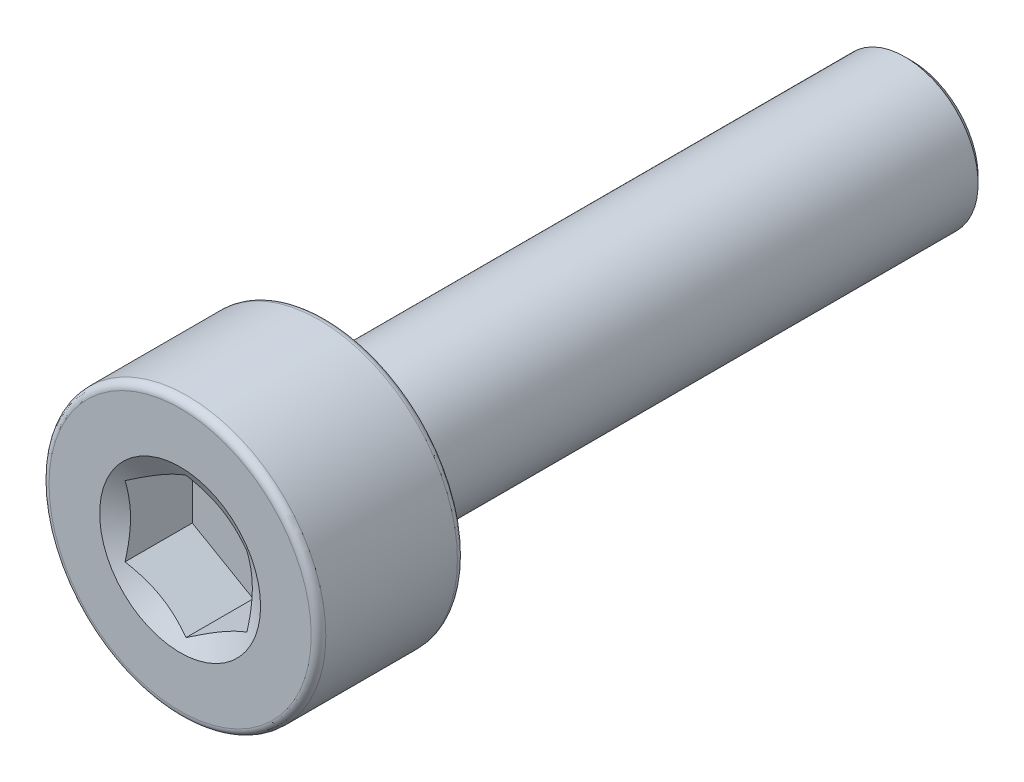
ISO-10303-21;
HEADER;
FILE_DESCRIPTION(('STEP AP214'),'2;1');
FILE_NAME('part.step','',(''),(''),'','','');
FILE_SCHEMA(('AUTOMOTIVE_DESIGN { 1 0 10303 214 1 1 1 1 }'));
ENDSEC;
DATA;
#1=APPLICATION_CONTEXT('core data for automotive mechanical design processes');
#2=APPLICATION_PROTOCOL_DEFINITION('international standard','automotive_design',2000,#1);
#3=PRODUCT_CONTEXT('',#1,'mechanical');
#4=PRODUCT('Part','Part','',(#3));
#5=PRODUCT_RELATED_PRODUCT_CATEGORY('part','',(#4));
#6=PRODUCT_DEFINITION_FORMATION('','',#4);
#7=PRODUCT_DEFINITION_CONTEXT('part definition',#1,'design');
#8=PRODUCT_DEFINITION('design','',#6,#7);
#9=PRODUCT_DEFINITION_SHAPE('','',#8);
#10=(LENGTH_UNIT() NAMED_UNIT(*) SI_UNIT(.MILLI.,.METRE.));
#11=(NAMED_UNIT(*) PLANE_ANGLE_UNIT() SI_UNIT($,.RADIAN.));
#12=(NAMED_UNIT(*) SI_UNIT($,.STERADIAN.) SOLID_ANGLE_UNIT());
#13=UNCERTAINTY_MEASURE_WITH_UNIT(LENGTH_MEASURE(1.E-05),#10,'distance_accuracy_value','');
#14=(GEOMETRIC_REPRESENTATION_CONTEXT(3) GLOBAL_UNCERTAINTY_ASSIGNED_CONTEXT((#13)) GLOBAL_UNIT_ASSIGNED_CONTEXT((#10,
#11,#12)) REPRESENTATION_CONTEXT('',''));
#15=CARTESIAN_POINT('',(0.,0.,0.));
#16=DIRECTION('',(0.,0.,1.));
#17=DIRECTION('',(1.,0.,0.));
#18=AXIS2_PLACEMENT_3D('',#15,#16,#17);
#19=CARTESIAN_POINT('',(0.,0.,-7.5));
#20=DIRECTION('',(0.,0.,-1.));
#21=DIRECTION('',(-1.,0.,0.));
#22=AXIS2_PLACEMENT_3D('',#19,#20,#21);
#23=PLANE('',#22);
#24=CARTESIAN_POINT('',(0.,0.,-7.5));
#25=DIRECTION('',(0.,0.,-1.));
#26=DIRECTION('',(-1.,0.,0.));
#27=AXIS2_PLACEMENT_3D('',#24,#25,#26);
#28=CIRCLE('',#27,1.375);
#29=CARTESIAN_POINT('',(-1.375,0.,-7.5));
#30=VERTEX_POINT('',#29);
#31=EDGE_CURVE('E55',#30,#30,#28,.T.);
#32=ORIENTED_EDGE('',*,*,#31,.T.);
#33=EDGE_LOOP('',(#32));
#34=FACE_BOUND('',#33,.T.);
#35=ADVANCED_FACE('F41',(#34),#23,.T.);
#36=CARTESIAN_POINT('',(0.,0.,-7.5));
#37=DIRECTION('',(0.,0.,1.));
#38=DIRECTION('',(1.,0.,0.));
#39=AXIS2_PLACEMENT_3D('',#36,#37,#38);
#40=CONICAL_SURFACE('',#39,1.375,0.785398163397447);
#41=CARTESIAN_POINT('',(0.,0.,-7.375));
#42=DIRECTION('',(0.,0.,-1.));
#43=DIRECTION('',(-1.,0.,0.));
#44=AXIS2_PLACEMENT_3D('',#41,#42,#43);
#45=CIRCLE('',#44,1.5);
#46=CARTESIAN_POINT('',(-1.5,0.,-7.375));
#47=VERTEX_POINT('',#46);
#48=EDGE_CURVE('E149',#47,#47,#45,.T.);
#49=ORIENTED_EDGE('',*,*,#48,.T.);
#50=EDGE_LOOP('',(#49));
#51=FACE_BOUND('',#50,.T.);
#52=ORIENTED_EDGE('',*,*,#31,.F.);
#53=EDGE_LOOP('',(#52));
#54=FACE_BOUND('',#53,.T.);
#55=ADVANCED_FACE('F157',(#51,#54),#40,.T.);
#56=CARTESIAN_POINT('',(0.,0.,-7.5));
#57=DIRECTION('',(0.,0.,-1.));
#58=DIRECTION('',(-1.,0.,0.));
#59=AXIS2_PLACEMENT_3D('',#56,#57,#58);
#60=CYLINDRICAL_SURFACE('',#59,1.5);
#61=CARTESIAN_POINT('',(0.,0.,4.5));
#62=DIRECTION('',(0.,0.,-1.));
#63=DIRECTION('',(-1.,0.,0.));
#64=AXIS2_PLACEMENT_3D('',#61,#62,#63);
#65=CIRCLE('',#64,1.5);
#66=CARTESIAN_POINT('',(-1.5,0.,4.5));
#67=VERTEX_POINT('',#66);
#68=EDGE_CURVE('E145',#67,#67,#65,.T.);
#69=ORIENTED_EDGE('',*,*,#68,.T.);
#70=EDGE_LOOP('',(#69));
#71=FACE_BOUND('',#70,.T.);
#72=ORIENTED_EDGE('',*,*,#48,.F.);
#73=EDGE_LOOP('',(#72));
#74=FACE_BOUND('',#73,.T.);
#75=ADVANCED_FACE('F159',(#71,#74),#60,.T.);
#76=CARTESIAN_POINT('',(0.,1.5,4.5));
#77=DIRECTION('',(0.,0.,-1.));
#78=DIRECTION('',(-1.,0.,0.));
#79=AXIS2_PLACEMENT_3D('',#76,#77,#78);
#80=PLANE('',#79);
#81=CARTESIAN_POINT('',(0.,0.,4.5));
#82=DIRECTION('',(0.,0.,-1.));
#83=DIRECTION('',(-1.,0.,0.));
#84=AXIS2_PLACEMENT_3D('',#81,#82,#83);
#85=CIRCLE('',#84,2.69);
#86=CARTESIAN_POINT('',(-2.69,0.,4.5));
#87=VERTEX_POINT('',#86);
#88=EDGE_CURVE('E141',#87,#87,#85,.T.);
#89=ORIENTED_EDGE('',*,*,#88,.T.);
#90=EDGE_LOOP('',(#89));
#91=FACE_BOUND('',#90,.T.);
#92=ORIENTED_EDGE('',*,*,#68,.F.);
#93=EDGE_LOOP('',(#92));
#94=FACE_BOUND('',#93,.T.);
#95=ADVANCED_FACE('F165',(#91,#94),#80,.T.);
#96=CARTESIAN_POINT('',(0.,0.,4.65));
#97=DIRECTION('',(0.,0.,-1.));
#98=DIRECTION('',(-1.,0.,0.));
#99=AXIS2_PLACEMENT_3D('',#96,#97,#98);
#100=TOROIDAL_SURFACE('',#99,2.69,0.15);
#101=CARTESIAN_POINT('',(0.,0.,4.65));
#102=DIRECTION('',(0.,0.,-1.));
#103=DIRECTION('',(-1.,0.,0.));
#104=AXIS2_PLACEMENT_3D('',#101,#102,#103);
#105=CIRCLE('',#104,2.84);
#106=CARTESIAN_POINT('',(-2.84,0.,4.65));
#107=VERTEX_POINT('',#106);
#108=EDGE_CURVE('E137',#107,#107,#105,.T.);
#109=ORIENTED_EDGE('',*,*,#108,.T.);
#110=EDGE_LOOP('',(#109));
#111=FACE_BOUND('',#110,.T.);
#112=ORIENTED_EDGE('',*,*,#88,.F.);
#113=EDGE_LOOP('',(#112));
#114=FACE_BOUND('',#113,.T.);
#115=ADVANCED_FACE('F171',(#111,#114),#100,.T.);
#116=CARTESIAN_POINT('',(0.,0.,-7.5));
#117=DIRECTION('',(0.,0.,-1.));
#118=DIRECTION('',(-1.,0.,0.));
#119=AXIS2_PLACEMENT_3D('',#116,#117,#118);
#120=CYLINDRICAL_SURFACE('',#119,2.84);
#121=CARTESIAN_POINT('',(0.,0.,7.35));
#122=DIRECTION('',(0.,0.,-1.));
#123=DIRECTION('',(-1.,0.,0.));
#124=AXIS2_PLACEMENT_3D('',#121,#122,#123);
#125=CIRCLE('',#124,2.84);
#126=CARTESIAN_POINT('',(-2.84,0.,7.35));
#127=VERTEX_POINT('',#126);
#128=EDGE_CURVE('E133',#127,#127,#125,.T.);
#129=ORIENTED_EDGE('',*,*,#128,.T.);
#130=EDGE_LOOP('',(#129));
#131=FACE_BOUND('',#130,.T.);
#132=ORIENTED_EDGE('',*,*,#108,.F.);
#133=EDGE_LOOP('',(#132));
#134=FACE_BOUND('',#133,.T.);
#135=ADVANCED_FACE('F175',(#131,#134),#120,.T.);
#136=CARTESIAN_POINT('',(0.,0.,7.35));
#137=DIRECTION('',(0.,0.,-1.));
#138=DIRECTION('',(-1.,0.,0.));
#139=AXIS2_PLACEMENT_3D('',#136,#137,#138);
#140=TOROIDAL_SURFACE('',#139,2.69,0.15);
#141=CARTESIAN_POINT('',(0.,0.,7.5));
#142=DIRECTION('',(0.,0.,-1.));
#143=DIRECTION('',(-1.,0.,0.));
#144=AXIS2_PLACEMENT_3D('',#141,#142,#143);
#145=CIRCLE('',#144,2.69);
#146=CARTESIAN_POINT('',(-2.69,0.,7.5));
#147=VERTEX_POINT('',#146);
#148=EDGE_CURVE('E129',#147,#147,#145,.T.);
#149=ORIENTED_EDGE('',*,*,#148,.T.);
#150=EDGE_LOOP('',(#149));
#151=FACE_BOUND('',#150,.T.);
#152=ORIENTED_EDGE('',*,*,#128,.F.);
#153=EDGE_LOOP('',(#152));
#154=FACE_BOUND('',#153,.T.);
#155=ADVANCED_FACE('F179',(#151,#154),#140,.T.);
#156=CARTESIAN_POINT('',(0.,2.69,7.5));
#157=DIRECTION('',(0.,0.,1.));
#158=DIRECTION('',(1.,0.,0.));
#159=AXIS2_PLACEMENT_3D('',#156,#157,#158);
#160=PLANE('',#159);
#161=CARTESIAN_POINT('',(0.,0.,7.5));
#162=DIRECTION('',(0.,0.,1.));
#163=DIRECTION('',(1.,0.,0.));
#164=AXIS2_PLACEMENT_3D('',#161,#162,#163);
#165=CIRCLE('',#164,1.65114639414505);
#166=CARTESIAN_POINT('',(1.65114639414505,0.,7.5));
#167=VERTEX_POINT('',#166);
#168=EDGE_CURVE('E287',#167,#167,#165,.T.);
#169=ORIENTED_EDGE('',*,*,#168,.F.);
#170=EDGE_LOOP('',(#169));
#171=FACE_BOUND('',#170,.T.);
#172=ORIENTED_EDGE('',*,*,#148,.F.);
#173=EDGE_LOOP('',(#172));
#174=FACE_BOUND('',#173,.T.);
#175=ADVANCED_FACE('F183',(#171,#174),#160,.T.);
#176=CARTESIAN_POINT('',(0.,0.,7.5));
#177=DIRECTION('',(0.,0.,1.));
#178=DIRECTION('',(1.,0.,0.));
#179=AXIS2_PLACEMENT_3D('',#176,#177,#178);
#180=CONICAL_SURFACE('',#179,1.65114639414505,1.0471975511966);
#181=ORIENTED_EDGE('',*,*,#168,.T.);
#182=EDGE_LOOP('',(#181));
#183=FACE_BOUND('',#182,.T.);
#184=CARTESIAN_POINT('',(1.2502,0.721572366433193,7.38011019286823));
#185=CARTESIAN_POINT('',(1.19526669476823,0.753288124996229,7.3617894329659));
#186=CARTESIAN_POINT('',(1.13985921349976,0.785277649221702,7.34512682440284));
#187=CARTESIAN_POINT('',(1.02808463239966,0.849810733708402,7.31604082214798));
#188=CARTESIAN_POINT('',(0.971715545158288,0.882355441401181,7.30362772017826));
#189=CARTESIAN_POINT('',(0.859676025913014,0.947041487997316,7.28430320583822));
#190=CARTESIAN_POINT('',(0.804022841540769,0.979172868975891,7.27726320764964));
#191=CARTESIAN_POINT('',(0.692454346091608,1.04358696985655,7.26885595083284));
#192=CARTESIAN_POINT('',(0.636539441062399,1.07586945532687,7.26748173340693));
#193=CARTESIAN_POINT('',(0.532042078818274,1.13620103554812,7.27032685557013));
#194=CARTESIAN_POINT('',(0.483444050118684,1.16425912049992,7.27384761702222));
#195=CARTESIAN_POINT('',(0.386564637826761,1.22019247526559,7.28501063090146));
#196=CARTESIAN_POINT('',(0.338283589807836,1.24806755133607,7.29265670377488));
#197=CARTESIAN_POINT('',(0.241204116145957,1.30411641158755,7.31177297290274));
#198=CARTESIAN_POINT('',(0.1924179896481,1.3322830948538,7.32332427518186));
#199=CARTESIAN_POINT('',(0.0955737477078975,1.38819614400745,7.3495418328961));
#200=CARTESIAN_POINT('',(0.0475143896730352,1.41594322730595,7.36420192034131));
#201=CARTESIAN_POINT('',(-0.000200000000000399,1.4434911430279,7.38011019286823));
#202=B_SPLINE_CURVE_WITH_KNOTS('',3,(#184,#185,#186,#187,#188,#189,#190,#191,#192,#193,#194,
#195,#196,#197,#198,#199,#200,#201),.UNSPECIFIED.,.F.,.F.,(4,2,2,2,2,2,2,2,4),(0.,
0.198150821029559,0.39677819631522,0.590488617354399,0.78396104931718,0.952480056398644,
1.1211553973001,1.2935743034359,1.4656542697693),.UNSPECIFIED.);
#203=CARTESIAN_POINT('',(1.25,0.721687836487031,7.38004351820221));
#204=VERTEX_POINT('',#203);
#205=CARTESIAN_POINT('',(0.,1.44337567297406,7.38004351820221));
#206=VERTEX_POINT('',#205);
#207=EDGE_CURVE('E110',#204,#206,#202,.T.);
#208=ORIENTED_EDGE('',*,*,#207,.F.);
#209=CARTESIAN_POINT('',(1.25,-1.89672738298304,7.85820739103665));
#210=CARTESIAN_POINT('',(1.25,-1.84244697339851,7.83204758050302));
#211=CARTESIAN_POINT('',(1.25,-1.78803742306522,7.80615118014362));
#212=CARTESIAN_POINT('',(1.25,-1.67889087538101,7.75503415816502));
#213=CARTESIAN_POINT('',(1.25,-1.62415382383406,7.72981365240367));
#214=CARTESIAN_POINT('',(1.25,-1.51398064315423,7.68006147462495));
#215=CARTESIAN_POINT('',(1.25,-1.45854229808874,7.65553468818875));
#216=CARTESIAN_POINT('',(1.25,-1.3472103466392,7.60754371169523));
#217=CARTESIAN_POINT('',(1.25,-1.29131676332858,7.58407946817427));
#218=CARTESIAN_POINT('',(1.25,-1.1773905129574,7.53784726543424));
#219=CARTESIAN_POINT('',(1.25,-1.11934204218602,7.5151177395224));
#220=CARTESIAN_POINT('',(1.25,-1.00256295352062,7.47149048953119));
#221=CARTESIAN_POINT('',(1.25,-0.943832252207076,7.45059299219036));
#222=CARTESIAN_POINT('',(1.25,-0.766698171960766,7.39149941011908));
#223=CARTESIAN_POINT('',(1.25,-0.647040815007729,7.35676986123052));
#224=CARTESIAN_POINT('',(1.25,-0.465275031508043,7.31610545317371));
#225=CARTESIAN_POINT('',(1.25,-0.404449052025901,7.30446938181936));
#226=CARTESIAN_POINT('',(1.25,-0.282083439429401,7.28576169296872));
#227=CARTESIAN_POINT('',(1.25,-0.220543865054811,7.27868970245605));
#228=CARTESIAN_POINT('',(1.25,-0.0978463032494955,7.26976463505209));
#229=CARTESIAN_POINT('',(1.25,-0.0366930766242037,7.26784779832336));
#230=CARTESIAN_POINT('',(1.25,0.0855533287559672,7.26922388244837));
#231=CARTESIAN_POINT('',(1.25,0.146646504184141,7.27251707726163));
#232=CARTESIAN_POINT('',(1.25,0.295739502729868,7.28662138689044));
#233=CARTESIAN_POINT('',(1.25,0.383482820966709,7.30014757839795));
#234=CARTESIAN_POINT('',(1.25,0.557311129169654,7.33546745225414));
#235=CARTESIAN_POINT('',(1.25,0.643394053579766,7.35727081202823));
#236=CARTESIAN_POINT('',(1.25,0.77216311196591,7.39471282943676));
#237=CARTESIAN_POINT('',(1.25,0.81551101183558,7.40816166837346));
#238=CARTESIAN_POINT('',(1.25,0.901755776899675,7.43635409429472));
#239=CARTESIAN_POINT('',(1.25,0.944652901540779,7.45109688501211));
#240=CARTESIAN_POINT('',(1.25,1.03005194087421,7.48165843781438));
#241=CARTESIAN_POINT('',(1.25,1.07255391468212,7.49747703591271));
#242=CARTESIAN_POINT('',(1.25,1.15721893845588,7.53001390964596));
#243=CARTESIAN_POINT('',(1.25,1.19938193143513,7.54673233306143));
#244=CARTESIAN_POINT('',(1.25,1.30957317351973,7.5915601021517));
#245=CARTESIAN_POINT('',(1.25,1.37735359090853,7.62027807640225));
#246=CARTESIAN_POINT('',(1.25,1.51227198573638,7.67918973729043));
#247=CARTESIAN_POINT('',(1.25,1.57940990698805,7.70938355160778));
#248=CARTESIAN_POINT('',(1.25,1.78008192300026,7.80164510995911));
#249=CARTESIAN_POINT('',(1.25,1.91284709613453,7.86538155434581));
#250=CARTESIAN_POINT('',(1.25,2.17721685013336,7.99562640704071));
#251=CARTESIAN_POINT('',(1.25,2.30881961832862,8.06213844802241));
#252=CARTESIAN_POINT('',(1.25,2.57110039577172,8.19691083988223));
#253=CARTESIAN_POINT('',(1.25,2.7017785387637,8.26517093102774));
#254=CARTESIAN_POINT('',(1.25,2.94959895946171,8.39607031881277));
#255=CARTESIAN_POINT('',(1.25,3.06680080815012,8.45859724686987));
#256=CARTESIAN_POINT('',(1.25,3.30082634149276,8.58436636721232));
#257=CARTESIAN_POINT('',(1.25,3.41765000951273,8.64760859042454));
#258=CARTESIAN_POINT('',(1.25,3.65068181727598,8.77444954911949));
#259=CARTESIAN_POINT('',(1.25,3.76689076518814,8.83804680186742));
#260=CARTESIAN_POINT('',(1.25,3.99907349967148,8.96565314056215));
#261=CARTESIAN_POINT('',(1.25,4.1150472996979,9.02966220201733));
#262=CARTESIAN_POINT('',(1.25,4.23093732511405,9.09382166319376));
#263=B_SPLINE_CURVE_WITH_KNOTS('',3,(#209,#210,#211,#212,#213,#214,#215,#216,#217,#218,#219,
#220,#221,#222,#223,#224,#225,#226,#227,#228,#229,#230,#231,#232,#233,#234,#235,#236,#237,#238,
#239,#240,#241,#242,#243,#244,#245,#246,#247,#248,#249,#250,#251,#252,#253,#254,#255,#256,#257,
#258,#259,#260,#261,#262),.UNSPECIFIED.,.F.,.F.,(4,2,2,2,2,2,2,2,2,2,2,2,2,2,2,2,2,2,2,2,2,2,2,
2,2,2,4),(0.,0.180768009400502,0.361566809316154,0.543421958009169,0.725267946159936,
0.912254441114668,1.0992640456265,1.47226798684474,1.65791746177348,1.84355176188995,
2.02687931237144,2.21021650310079,2.47601053535726,2.74211628817199,2.8782594310705,
3.01431937437467,3.15035862419056,3.28642028465225,3.50723410295543,3.72806705850746,
4.16982133944192,4.61217312406906,5.05445955926298,5.45297027921854,5.85149829575065,
6.24891679007933,6.64631186318741),.UNSPECIFIED.);
#264=CARTESIAN_POINT('',(1.25,-0.72168783648703,7.38004351820221));
#265=VERTEX_POINT('',#264);
#266=EDGE_CURVE('E229',#265,#204,#263,.T.);
#267=ORIENTED_EDGE('',*,*,#266,.F.);
#268=CARTESIAN_POINT('',(-0.000200000000000427,-1.4434911430279,7.38011019286823));
#269=CARTESIAN_POINT('',(0.0547333052317645,-1.41177538446486,7.3617894329659));
#270=CARTESIAN_POINT('',(0.110140786500239,-1.37978586023939,7.34512682440284));
#271=CARTESIAN_POINT('',(0.221915367600339,-1.31525277575269,7.31604082214798));
#272=CARTESIAN_POINT('',(0.278284454841709,-1.28270806805991,7.30362772017826));
#273=CARTESIAN_POINT('',(0.390323974086983,-1.21802202146378,7.28430320583822));
#274=CARTESIAN_POINT('',(0.445977158459228,-1.1858906404852,7.27726320764964));
#275=CARTESIAN_POINT('',(0.55754565390839,-1.12147653960455,7.26885595083284));
#276=CARTESIAN_POINT('',(0.613460558937598,-1.08919405413422,7.26748173340693));
#277=CARTESIAN_POINT('',(0.717957921181723,-1.02886247391297,7.27032685557013));
#278=CARTESIAN_POINT('',(0.766555949881313,-1.00080438896118,7.27384761702222));
#279=CARTESIAN_POINT('',(0.863435362173236,-0.944871034195502,7.28501063090146));
#280=CARTESIAN_POINT('',(0.911716410192161,-0.916995958125018,7.29265670377488));
#281=CARTESIAN_POINT('',(1.00879588385404,-0.860947097873545,7.31177297290274));
#282=CARTESIAN_POINT('',(1.0575820103519,-0.832780414607288,7.32332427518186));
#283=CARTESIAN_POINT('',(1.1544262522921,-0.776867365453647,7.3495418328961));
#284=CARTESIAN_POINT('',(1.20248561032696,-0.749120282155139,7.36420192034131));
#285=CARTESIAN_POINT('',(1.2502,-0.721572366433193,7.38011019286823));
#286=B_SPLINE_CURVE_WITH_KNOTS('',3,(#268,#269,#270,#271,#272,#273,#274,#275,#276,#277,#278,
#279,#280,#281,#282,#283,#284,#285),.UNSPECIFIED.,.F.,.F.,(4,2,2,2,2,2,2,2,4),(0.,
0.198150821029559,0.39677819631522,0.590488617354398,0.78396104931718,0.952480056398644,
1.1211553973001,1.2935743034359,1.4656542697693),.UNSPECIFIED.);
#287=CARTESIAN_POINT('',(0.,-1.44337567297406,7.38004351820221));
#288=VERTEX_POINT('',#287);
#289=EDGE_CURVE('E223',#288,#265,#286,.T.);
#290=ORIENTED_EDGE('',*,*,#289,.F.);
#291=CARTESIAN_POINT('',(-1.2502,-0.721572366433193,7.38011019286823));
#292=CARTESIAN_POINT('',(-1.19526669476823,-0.753288124996229,7.3617894329659));
#293=CARTESIAN_POINT('',(-1.13985921349976,-0.785277649221702,7.34512682440284));
#294=CARTESIAN_POINT('',(-1.02808463239966,-0.849810733708402,7.31604082214798));
#295=CARTESIAN_POINT('',(-0.971715545158288,-0.882355441401181,7.30362772017826));
#296=CARTESIAN_POINT('',(-0.859676025913014,-0.947041487997316,7.28430320583822));
#297=CARTESIAN_POINT('',(-0.804022841540769,-0.979172868975892,7.27726320764964));
#298=CARTESIAN_POINT('',(-0.692454346091607,-1.04358696985655,7.26885595083284));
#299=CARTESIAN_POINT('',(-0.636539441062398,-1.07586945532687,7.26748173340693));
#300=CARTESIAN_POINT('',(-0.532042078818274,-1.13620103554812,7.27032685557013));
#301=CARTESIAN_POINT('',(-0.483444050118684,-1.16425912049992,7.27384761702222));
#302=CARTESIAN_POINT('',(-0.386564637826761,-1.22019247526559,7.28501063090146));
#303=CARTESIAN_POINT('',(-0.338283589807836,-1.24806755133608,7.29265670377488));
#304=CARTESIAN_POINT('',(-0.241204116145957,-1.30411641158755,7.31177297290274));
#305=CARTESIAN_POINT('',(-0.1924179896481,-1.3322830948538,7.32332427518187));
#306=CARTESIAN_POINT('',(-0.0955737477078978,-1.38819614400745,7.3495418328961));
#307=CARTESIAN_POINT('',(-0.0475143896730358,-1.41594322730595,7.36420192034131));
#308=CARTESIAN_POINT('',(0.000199999999999786,-1.4434911430279,7.38011019286823));
#309=B_SPLINE_CURVE_WITH_KNOTS('',3,(#291,#292,#293,#294,#295,#296,#297,#298,#299,#300,#301,
#302,#303,#304,#305,#306,#307,#308),.UNSPECIFIED.,.F.,.F.,(4,2,2,2,2,2,2,2,4),(0.,
0.198150821029559,0.39677819631522,0.590488617354399,0.783961049317181,0.952480056398644,
1.1211553973001,1.2935743034359,1.4656542697693),.UNSPECIFIED.);
#310=CARTESIAN_POINT('',(-1.25,-0.721687836487031,7.38004351820221));
#311=VERTEX_POINT('',#310);
#312=EDGE_CURVE('E62',#311,#288,#309,.T.);
#313=ORIENTED_EDGE('',*,*,#312,.F.);
#314=CARTESIAN_POINT('',(-1.25,-1.89672738298304,7.85820739103665));
#315=CARTESIAN_POINT('',(-1.25,-1.84244697339851,7.83204758050302));
#316=CARTESIAN_POINT('',(-1.25,-1.78803742306522,7.80615118014362));
#317=CARTESIAN_POINT('',(-1.25,-1.67889087538101,7.75503415816502));
#318=CARTESIAN_POINT('',(-1.25,-1.62415382383407,7.72981365240367));
#319=CARTESIAN_POINT('',(-1.25,-1.51398064315423,7.68006147462495));
#320=CARTESIAN_POINT('',(-1.25,-1.45854229808874,7.65553468818875));
#321=CARTESIAN_POINT('',(-1.25,-1.3472103466392,7.60754371169523));
#322=CARTESIAN_POINT('',(-1.25,-1.29131676332858,7.58407946817427));
#323=CARTESIAN_POINT('',(-1.25,-1.1773905129574,7.53784726543424));
#324=CARTESIAN_POINT('',(-1.25,-1.11934204218602,7.5151177395224));
#325=CARTESIAN_POINT('',(-1.25,-1.00256295352062,7.47149048953119));
#326=CARTESIAN_POINT('',(-1.25,-0.943832252207076,7.45059299219036));
#327=CARTESIAN_POINT('',(-1.25,-0.766698171960767,7.39149941011908));
#328=CARTESIAN_POINT('',(-1.25,-0.647040815007729,7.35676986123052));
#329=CARTESIAN_POINT('',(-1.25,-0.465275031508043,7.31610545317371));
#330=CARTESIAN_POINT('',(-1.25,-0.404449052025901,7.30446938181936));
#331=CARTESIAN_POINT('',(-1.25,-0.282083439429401,7.28576169296872));
#332=CARTESIAN_POINT('',(-1.25,-0.220543865054811,7.27868970245605));
#333=CARTESIAN_POINT('',(-1.25,-0.0978463032494959,7.26976463505209));
#334=CARTESIAN_POINT('',(-1.25,-0.0366930766242041,7.26784779832336));
#335=CARTESIAN_POINT('',(-1.25,0.0855533287559667,7.26922388244837));
#336=CARTESIAN_POINT('',(-1.25,0.14664650418414,7.27251707726163));
#337=CARTESIAN_POINT('',(-1.25,0.295739502729868,7.28662138689044));
#338=CARTESIAN_POINT('',(-1.25,0.383482820966708,7.30014757839795));
#339=CARTESIAN_POINT('',(-1.25,0.557311129169653,7.33546745225414));
#340=CARTESIAN_POINT('',(-1.25,0.643394053579765,7.35727081202823));
#341=CARTESIAN_POINT('',(-1.25,0.772163111965909,7.39471282943676));
#342=CARTESIAN_POINT('',(-1.25,0.815511011835579,7.40816166837345));
#343=CARTESIAN_POINT('',(-1.25,0.901755776899674,7.43635409429472));
#344=CARTESIAN_POINT('',(-1.25,0.944652901540778,7.45109688501211));
#345=CARTESIAN_POINT('',(-1.25,1.03005194087421,7.48165843781438));
#346=CARTESIAN_POINT('',(-1.25,1.07255391468212,7.49747703591271));
#347=CARTESIAN_POINT('',(-1.25,1.15721893845588,7.53001390964596));
#348=CARTESIAN_POINT('',(-1.25,1.19938193143513,7.54673233306143));
#349=CARTESIAN_POINT('',(-1.25,1.30957317351973,7.5915601021517));
#350=CARTESIAN_POINT('',(-1.25,1.37735359090853,7.62027807640225));
#351=CARTESIAN_POINT('',(-1.25,1.51227198573638,7.67918973729043));
#352=CARTESIAN_POINT('',(-1.25,1.57940990698804,7.70938355160778));
#353=CARTESIAN_POINT('',(-1.25,1.78008192300026,7.80164510995911));
#354=CARTESIAN_POINT('',(-1.25,1.91284709613453,7.86538155434581));
#355=CARTESIAN_POINT('',(-1.25,2.17721685013336,7.99562640704071));
#356=CARTESIAN_POINT('',(-1.25,2.30881961832861,8.06213844802241));
#357=CARTESIAN_POINT('',(-1.25,2.57110039577171,8.19691083988223));
#358=CARTESIAN_POINT('',(-1.25,2.7017785387637,8.26517093102774));
#359=CARTESIAN_POINT('',(-1.25,2.94959895946171,8.39607031881277));
#360=CARTESIAN_POINT('',(-1.25,3.06680080815011,8.45859724686986));
#361=CARTESIAN_POINT('',(-1.25,3.30082634149275,8.58436636721232));
#362=CARTESIAN_POINT('',(-1.25,3.41765000951273,8.64760859042454));
#363=CARTESIAN_POINT('',(-1.25,3.65068181727598,8.77444954911949));
#364=CARTESIAN_POINT('',(-1.25,3.76689076518814,8.83804680186742));
#365=CARTESIAN_POINT('',(-1.25,3.99907349967148,8.96565314056215));
#366=CARTESIAN_POINT('',(-1.25,4.1150472996979,9.02966220201733));
#367=CARTESIAN_POINT('',(-1.25,4.23093732511405,9.09382166319376));
#368=B_SPLINE_CURVE_WITH_KNOTS('',3,(#314,#315,#316,#317,#318,#319,#320,#321,#322,#323,#324,
#325,#326,#327,#328,#329,#330,#331,#332,#333,#334,#335,#336,#337,#338,#339,#340,#341,#342,#343,
#344,#345,#346,#347,#348,#349,#350,#351,#352,#353,#354,#355,#356,#357,#358,#359,#360,#361,#362,
#363,#364,#365,#366,#367),.UNSPECIFIED.,.F.,.F.,(4,2,2,2,2,2,2,2,2,2,2,2,2,2,2,2,2,2,2,2,2,2,2,
2,2,2,4),(0.,0.180768009400503,0.361566809316154,0.543421958009171,0.725267946159938,
0.912254441114669,1.0992640456265,1.47226798684474,1.65791746177348,1.84355176188995,
2.02687931237144,2.21021650310079,2.47601053535727,2.74211628817199,2.8782594310705,
3.01431937437467,3.15035862419056,3.28642028465225,3.50723410295543,3.72806705850746,
4.16982133944192,4.61217312406906,5.05445955926298,5.45297027921854,5.85149829575065,
6.24891679007933,6.64631186318741),.UNSPECIFIED.);
#369=CARTESIAN_POINT('',(-1.25,0.721687836487031,7.38004351820221));
#370=VERTEX_POINT('',#369);
#371=EDGE_CURVE('E11',#370,#311,#368,.F.);
#372=ORIENTED_EDGE('',*,*,#371,.F.);
#373=CARTESIAN_POINT('',(0.000199999999999659,1.4434911430279,7.38011019286823));
#374=CARTESIAN_POINT('',(-0.0547333052317652,1.41177538446486,7.3617894329659));
#375=CARTESIAN_POINT('',(-0.11014078650024,1.37978586023939,7.34512682440284));
#376=CARTESIAN_POINT('',(-0.22191536760034,1.31525277575269,7.31604082214798));
#377=CARTESIAN_POINT('',(-0.27828445484171,1.28270806805991,7.30362772017826));
#378=CARTESIAN_POINT('',(-0.390323974086984,1.21802202146378,7.28430320583822));
#379=CARTESIAN_POINT('',(-0.445977158459229,1.1858906404852,7.27726320764964));
#380=CARTESIAN_POINT('',(-0.557545653908391,1.12147653960455,7.26885595083284));
#381=CARTESIAN_POINT('',(-0.6134605589376,1.08919405413422,7.26748173340693));
#382=CARTESIAN_POINT('',(-0.717957921181724,1.02886247391297,7.27032685557013));
#383=CARTESIAN_POINT('',(-0.766555949881314,1.00080438896118,7.27384761702222));
#384=CARTESIAN_POINT('',(-0.863435362173237,0.944871034195502,7.28501063090146));
#385=CARTESIAN_POINT('',(-0.911716410192162,0.916995958125019,7.29265670377488));
#386=CARTESIAN_POINT('',(-1.00879588385404,0.860947097873545,7.31177297290274));
#387=CARTESIAN_POINT('',(-1.0575820103519,0.832780414607288,7.32332427518186));
#388=CARTESIAN_POINT('',(-1.1544262522921,0.776867365453647,7.3495418328961));
#389=CARTESIAN_POINT('',(-1.20248561032696,0.749120282155139,7.36420192034131));
#390=CARTESIAN_POINT('',(-1.2502,0.721572366433193,7.38011019286823));
#391=B_SPLINE_CURVE_WITH_KNOTS('',3,(#373,#374,#375,#376,#377,#378,#379,#380,#381,#382,#383,
#384,#385,#386,#387,#388,#389,#390),.UNSPECIFIED.,.F.,.F.,(4,2,2,2,2,2,2,2,4),(0.,
0.198150821029559,0.39677819631522,0.590488617354399,0.783961049317181,0.952480056398644,
1.1211553973001,1.2935743034359,1.4656542697693),.UNSPECIFIED.);
#392=EDGE_CURVE('E100',#206,#370,#391,.T.);
#393=ORIENTED_EDGE('',*,*,#392,.F.);
#394=EDGE_LOOP('',(#208,#267,#290,#313,#372,#393));
#395=FACE_BOUND('',#394,.T.);
#396=ADVANCED_FACE('F99',(#183,#395),#180,.F.);
#397=CARTESIAN_POINT('',(0.,0.,6.));
#398=DIRECTION('',(0.,0.,1.));
#399=DIRECTION('',(1.,0.,0.));
#400=AXIS2_PLACEMENT_3D('',#397,#398,#399);
#401=PLANE('',#400);
#402=DIRECTION('',(-0.866025403784439,-0.5,0.));
#403=VECTOR('',#402,1.);
#404=CARTESIAN_POINT('',(0.,1.44337567297406,6.));
#405=LINE('',#404,#403);
#406=CARTESIAN_POINT('',(0.,1.44337567297406,6.));
#407=VERTEX_POINT('',#406);
#408=CARTESIAN_POINT('',(-1.25,0.721687836487031,6.));
#409=VERTEX_POINT('',#408);
#410=EDGE_CURVE('E109',#407,#409,#405,.T.);
#411=ORIENTED_EDGE('',*,*,#410,.T.);
#412=DIRECTION('',(0.,-1.,0.));
#413=VECTOR('',#412,1.);
#414=CARTESIAN_POINT('',(-1.25,0.721687836487031,6.));
#415=LINE('',#414,#413);
#416=CARTESIAN_POINT('',(-1.25,-0.721687836487031,6.));
#417=VERTEX_POINT('',#416);
#418=EDGE_CURVE('E114',#409,#417,#415,.T.);
#419=ORIENTED_EDGE('',*,*,#418,.T.);
#420=DIRECTION('',(0.866025403784439,-0.5,0.));
#421=VECTOR('',#420,1.);
#422=CARTESIAN_POINT('',(-1.25,-0.721687836487031,6.));
#423=LINE('',#422,#421);
#424=CARTESIAN_POINT('',(0.,-1.44337567297406,6.));
#425=VERTEX_POINT('',#424);
#426=EDGE_CURVE('E256',#417,#425,#423,.T.);
#427=ORIENTED_EDGE('',*,*,#426,.T.);
#428=DIRECTION('',(0.866025403784439,0.5,0.));
#429=VECTOR('',#428,1.);
#430=CARTESIAN_POINT('',(0.,-1.44337567297406,6.));
#431=LINE('',#430,#429);
#432=CARTESIAN_POINT('',(1.25,-0.72168783648703,6.));
#433=VERTEX_POINT('',#432);
#434=EDGE_CURVE('E261',#425,#433,#431,.T.);
#435=ORIENTED_EDGE('',*,*,#434,.T.);
#436=DIRECTION('',(0.,1.,0.));
#437=VECTOR('',#436,1.);
#438=CARTESIAN_POINT('',(1.25,-0.72168783648703,6.));
#439=LINE('',#438,#437);
#440=CARTESIAN_POINT('',(1.25,0.721687836487031,6.));
#441=VERTEX_POINT('',#440);
#442=EDGE_CURVE('E125',#433,#441,#439,.T.);
#443=ORIENTED_EDGE('',*,*,#442,.T.);
#444=DIRECTION('',(-0.866025403784439,0.5,0.));
#445=VECTOR('',#444,1.);
#446=CARTESIAN_POINT('',(1.25,0.721687836487031,6.));
#447=LINE('',#446,#445);
#448=EDGE_CURVE('E118',#441,#407,#447,.T.);
#449=ORIENTED_EDGE('',*,*,#448,.T.);
#450=EDGE_LOOP('',(#411,#419,#427,#435,#443,#449));
#451=FACE_BOUND('',#450,.T.);
#452=ADVANCED_FACE('F209',(#451),#401,.T.);
#453=CARTESIAN_POINT('',(-1.25,0.721687836487031,6.));
#454=DIRECTION('',(-1.,0.,0.));
#455=DIRECTION('',(0.,0.,1.));
#456=AXIS2_PLACEMENT_3D('',#453,#454,#455);
#457=PLANE('',#456);
#458=DIRECTION('',(0.,0.,1.));
#459=VECTOR('',#458,1.);
#460=CARTESIAN_POINT('',(-1.25,0.721687836487031,6.));
#461=LINE('',#460,#459);
#462=EDGE_CURVE('E106',#409,#370,#461,.T.);
#463=ORIENTED_EDGE('',*,*,#462,.T.);
#464=ORIENTED_EDGE('',*,*,#371,.T.);
#465=DIRECTION('',(0.,0.,1.));
#466=VECTOR('',#465,1.);
#467=CARTESIAN_POINT('',(-1.25,-0.721687836487031,6.));
#468=LINE('',#467,#466);
#469=EDGE_CURVE('E117',#417,#311,#468,.T.);
#470=ORIENTED_EDGE('',*,*,#469,.F.);
#471=ORIENTED_EDGE('',*,*,#418,.F.);
#472=EDGE_LOOP('',(#463,#464,#470,#471));
#473=FACE_BOUND('',#472,.T.);
#474=ADVANCED_FACE('F112',(#473),#457,.F.);
#475=CARTESIAN_POINT('',(-1.25,-0.721687836487031,6.));
#476=DIRECTION('',(-0.5,-0.866025403784439,0.));
#477=DIRECTION('',(0.866025403784439,-0.5,0.));
#478=AXIS2_PLACEMENT_3D('',#475,#476,#477);
#479=PLANE('',#478);
#480=ORIENTED_EDGE('',*,*,#469,.T.);
#481=ORIENTED_EDGE('',*,*,#312,.T.);
#482=DIRECTION('',(0.,0.,1.));
#483=VECTOR('',#482,1.);
#484=CARTESIAN_POINT('',(0.,-1.44337567297406,6.));
#485=LINE('',#484,#483);
#486=EDGE_CURVE('E122',#425,#288,#485,.T.);
#487=ORIENTED_EDGE('',*,*,#486,.F.);
#488=ORIENTED_EDGE('',*,*,#426,.F.);
#489=EDGE_LOOP('',(#480,#481,#487,#488));
#490=FACE_BOUND('',#489,.T.);
#491=ADVANCED_FACE('F245',(#490),#479,.F.);
#492=CARTESIAN_POINT('',(0.,-1.44337567297406,6.));
#493=DIRECTION('',(0.5,-0.866025403784438,0.));
#494=DIRECTION('',(0.866025403784439,0.5,0.));
#495=AXIS2_PLACEMENT_3D('',#492,#493,#494);
#496=PLANE('',#495);
#497=ORIENTED_EDGE('',*,*,#486,.T.);
#498=ORIENTED_EDGE('',*,*,#289,.T.);
#499=DIRECTION('',(0.,0.,1.));
#500=VECTOR('',#499,1.);
#501=CARTESIAN_POINT('',(1.25,-0.72168783648703,6.));
#502=LINE('',#501,#500);
#503=EDGE_CURVE('E277',#433,#265,#502,.T.);
#504=ORIENTED_EDGE('',*,*,#503,.F.);
#505=ORIENTED_EDGE('',*,*,#434,.F.);
#506=EDGE_LOOP('',(#497,#498,#504,#505));
#507=FACE_BOUND('',#506,.T.);
#508=ADVANCED_FACE('F240',(#507),#496,.F.);
#509=CARTESIAN_POINT('',(1.25,-0.72168783648703,6.));
#510=DIRECTION('',(1.,0.,0.));
#511=DIRECTION('',(0.,0.,-1.));
#512=AXIS2_PLACEMENT_3D('',#509,#510,#511);
#513=PLANE('',#512);
#514=ORIENTED_EDGE('',*,*,#503,.T.);
#515=ORIENTED_EDGE('',*,*,#266,.T.);
#516=DIRECTION('',(0.,0.,1.));
#517=VECTOR('',#516,1.);
#518=CARTESIAN_POINT('',(1.25,0.721687836487031,6.));
#519=LINE('',#518,#517);
#520=EDGE_CURVE('E273',#441,#204,#519,.T.);
#521=ORIENTED_EDGE('',*,*,#520,.F.);
#522=ORIENTED_EDGE('',*,*,#442,.F.);
#523=EDGE_LOOP('',(#514,#515,#521,#522));
#524=FACE_BOUND('',#523,.T.);
#525=ADVANCED_FACE('F237',(#524),#513,.F.);
#526=CARTESIAN_POINT('',(1.25,0.721687836487031,6.));
#527=DIRECTION('',(0.5,0.866025403784439,0.));
#528=DIRECTION('',(-0.866025403784439,0.5,0.));
#529=AXIS2_PLACEMENT_3D('',#526,#527,#528);
#530=PLANE('',#529);
#531=ORIENTED_EDGE('',*,*,#520,.T.);
#532=ORIENTED_EDGE('',*,*,#207,.T.);
#533=DIRECTION('',(0.,0.,1.));
#534=VECTOR('',#533,1.);
#535=CARTESIAN_POINT('',(0.,1.44337567297406,6.));
#536=LINE('',#535,#534);
#537=EDGE_CURVE('E69',#407,#206,#536,.T.);
#538=ORIENTED_EDGE('',*,*,#537,.F.);
#539=ORIENTED_EDGE('',*,*,#448,.F.);
#540=EDGE_LOOP('',(#531,#532,#538,#539));
#541=FACE_BOUND('',#540,.T.);
#542=ADVANCED_FACE('F190',(#541),#530,.F.);
#543=CARTESIAN_POINT('',(0.,1.44337567297406,6.));
#544=DIRECTION('',(-0.5,0.866025403784438,0.));
#545=DIRECTION('',(-0.866025403784439,-0.5,0.));
#546=AXIS2_PLACEMENT_3D('',#543,#544,#545);
#547=PLANE('',#546);
#548=ORIENTED_EDGE('',*,*,#537,.T.);
#549=ORIENTED_EDGE('',*,*,#392,.T.);
#550=ORIENTED_EDGE('',*,*,#462,.F.);
#551=ORIENTED_EDGE('',*,*,#410,.F.);
#552=EDGE_LOOP('',(#548,#549,#550,#551));
#553=FACE_BOUND('',#552,.T.);
#554=ADVANCED_FACE('F105',(#553),#547,.F.);
#555=CLOSED_SHELL('',(#35,#55,#75,#95,#115,#135,#155,#175,#396,#452,#474,#491,#508,#525,#542,#554));
#556=MANIFOLD_SOLID_BREP('B2',#555);
#557=ADVANCED_BREP_SHAPE_REPRESENTATION('',(#18,#556),#14);
#558=SHAPE_DEFINITION_REPRESENTATION(#9,#557);
ENDSEC;
END-ISO-10303-21;
